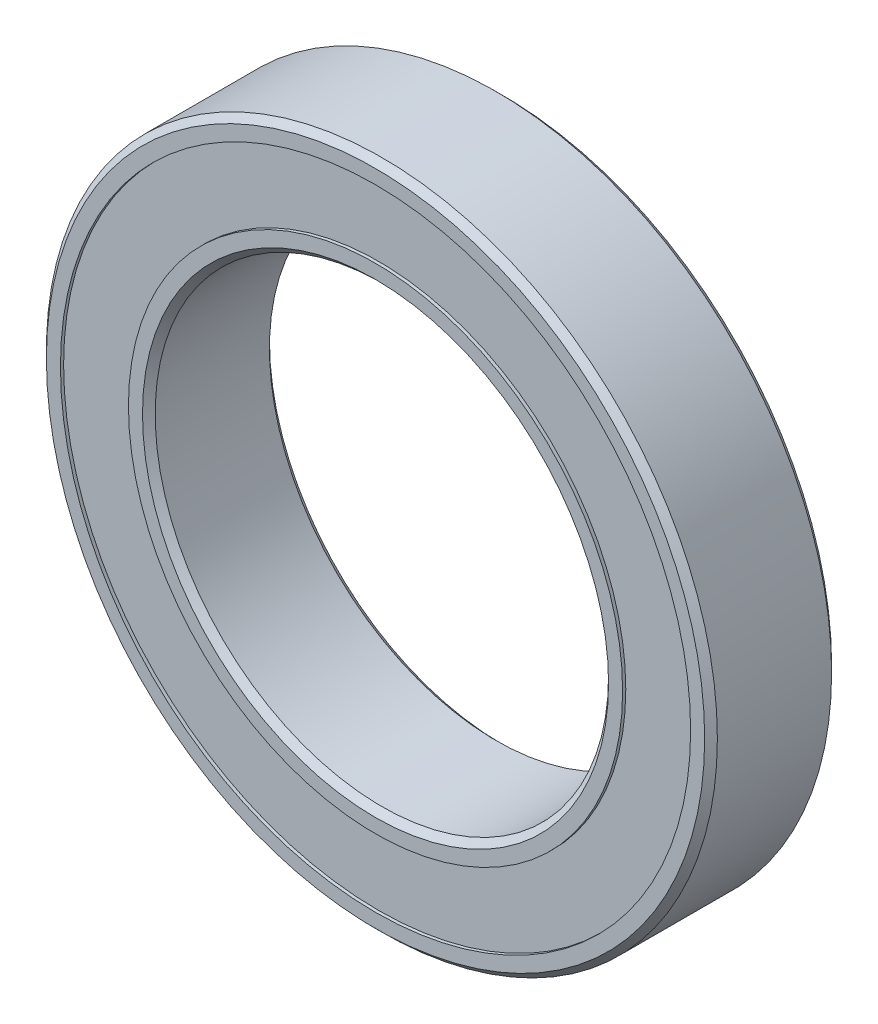
ISO-10303-21;
HEADER;
FILE_DESCRIPTION(('STEP AP214'),'2;1');
FILE_NAME('part.step','',(''),(''),'','','');
FILE_SCHEMA(('AUTOMOTIVE_DESIGN { 1 0 10303 214 1 1 1 1 }'));
ENDSEC;
DATA;
#1=APPLICATION_CONTEXT('core data for automotive mechanical design processes');
#2=APPLICATION_PROTOCOL_DEFINITION('international standard','automotive_design',2000,#1);
#3=PRODUCT_CONTEXT('',#1,'mechanical');
#4=PRODUCT('Part','Part','',(#3));
#5=PRODUCT_RELATED_PRODUCT_CATEGORY('part','',(#4));
#6=PRODUCT_DEFINITION_FORMATION('','',#4);
#7=PRODUCT_DEFINITION_CONTEXT('part definition',#1,'design');
#8=PRODUCT_DEFINITION('design','',#6,#7);
#9=PRODUCT_DEFINITION_SHAPE('','',#8);
#10=(LENGTH_UNIT() NAMED_UNIT(*) SI_UNIT(.MILLI.,.METRE.));
#11=(NAMED_UNIT(*) PLANE_ANGLE_UNIT() SI_UNIT($,.RADIAN.));
#12=(NAMED_UNIT(*) SI_UNIT($,.STERADIAN.) SOLID_ANGLE_UNIT());
#13=UNCERTAINTY_MEASURE_WITH_UNIT(LENGTH_MEASURE(1.E-05),#10,'distance_accuracy_value','');
#14=(GEOMETRIC_REPRESENTATION_CONTEXT(3) GLOBAL_UNCERTAINTY_ASSIGNED_CONTEXT((#13)) GLOBAL_UNIT_ASSIGNED_CONTEXT((#10,
#11,#12)) REPRESENTATION_CONTEXT('',''));
#15=CARTESIAN_POINT('',(0.,0.,0.));
#16=DIRECTION('',(0.,0.,1.));
#17=DIRECTION('',(1.,0.,0.));
#18=AXIS2_PLACEMENT_3D('',#15,#16,#17);
#19=CARTESIAN_POINT('',(0.,17.375,-3.325));
#20=DIRECTION('',(0.,0.,1.));
#21=DIRECTION('',(1.,0.,0.));
#22=AXIS2_PLACEMENT_3D('',#19,#20,#21);
#23=PLANE('',#22);
#24=CARTESIAN_POINT('',(0.,0.,-3.325));
#25=DIRECTION('',(0.,0.,1.));
#26=DIRECTION('',(1.,0.,0.));
#27=AXIS2_PLACEMENT_3D('',#24,#25,#26);
#28=CIRCLE('',#27,17.375);
#29=CARTESIAN_POINT('',(17.375,0.,-3.325));
#30=VERTEX_POINT('',#29);
#31=EDGE_CURVE('E69',#30,#30,#28,.T.);
#32=ORIENTED_EDGE('',*,*,#31,.F.);
#33=EDGE_LOOP('',(#32));
#34=FACE_BOUND('',#33,.T.);
#35=CARTESIAN_POINT('',(0.,0.,-3.325));
#36=DIRECTION('',(0.,0.,1.));
#37=DIRECTION('',(1.,0.,0.));
#38=AXIS2_PLACEMENT_3D('',#35,#36,#37);
#39=CIRCLE('',#38,13.625);
#40=CARTESIAN_POINT('',(13.625,0.,-3.325));
#41=VERTEX_POINT('',#40);
#42=EDGE_CURVE('E11',#41,#41,#39,.T.);
#43=ORIENTED_EDGE('',*,*,#42,.T.);
#44=EDGE_LOOP('',(#43));
#45=FACE_BOUND('',#44,.T.);
#46=ADVANCED_FACE('F55',(#34,#45),#23,.F.);
#47=CARTESIAN_POINT('',(0.,0.,3.5));
#48=DIRECTION('',(0.,0.,1.));
#49=DIRECTION('',(1.,0.,0.));
#50=AXIS2_PLACEMENT_3D('',#47,#48,#49);
#51=CYLINDRICAL_SURFACE('',#50,13.625);
#52=ORIENTED_EDGE('',*,*,#42,.F.);
#53=EDGE_LOOP('',(#52));
#54=FACE_BOUND('',#53,.T.);
#55=CARTESIAN_POINT('',(0.,0.,-2.4362631398147));
#56=DIRECTION('',(0.,0.,1.));
#57=DIRECTION('',(1.,0.,0.));
#58=AXIS2_PLACEMENT_3D('',#55,#56,#57);
#59=CIRCLE('',#58,13.625);
#60=CARTESIAN_POINT('',(13.625,0.,-2.4362631398147));
#61=VERTEX_POINT('',#60);
#62=EDGE_CURVE('E61',#61,#61,#59,.T.);
#63=ORIENTED_EDGE('',*,*,#62,.T.);
#64=EDGE_LOOP('',(#63));
#65=FACE_BOUND('',#64,.T.);
#66=ADVANCED_FACE('F78',(#54,#65),#51,.F.);
#67=CARTESIAN_POINT('',(0.,17.375,-2.4362631398147));
#68=DIRECTION('',(0.,0.,-1.));
#69=DIRECTION('',(-1.,0.,0.));
#70=AXIS2_PLACEMENT_3D('',#67,#68,#69);
#71=PLANE('',#70);
#72=ORIENTED_EDGE('',*,*,#62,.F.);
#73=EDGE_LOOP('',(#72));
#74=FACE_BOUND('',#73,.T.);
#75=CARTESIAN_POINT('',(0.,0.,-2.4362631398147));
#76=DIRECTION('',(0.,0.,1.));
#77=DIRECTION('',(1.,0.,0.));
#78=AXIS2_PLACEMENT_3D('',#75,#76,#77);
#79=CIRCLE('',#78,17.375);
#80=CARTESIAN_POINT('',(17.375,0.,-2.4362631398147));
#81=VERTEX_POINT('',#80);
#82=EDGE_CURVE('E65',#81,#81,#79,.T.);
#83=ORIENTED_EDGE('',*,*,#82,.T.);
#84=EDGE_LOOP('',(#83));
#85=FACE_BOUND('',#84,.T.);
#86=ADVANCED_FACE('F82',(#74,#85),#71,.F.);
#87=CARTESIAN_POINT('',(0.,0.,3.5));
#88=DIRECTION('',(0.,0.,1.));
#89=DIRECTION('',(1.,0.,0.));
#90=AXIS2_PLACEMENT_3D('',#87,#88,#89);
#91=CYLINDRICAL_SURFACE('',#90,17.375);
#92=ORIENTED_EDGE('',*,*,#82,.F.);
#93=EDGE_LOOP('',(#92));
#94=FACE_BOUND('',#93,.T.);
#95=ORIENTED_EDGE('',*,*,#31,.T.);
#96=EDGE_LOOP('',(#95));
#97=FACE_BOUND('',#96,.T.);
#98=ADVANCED_FACE('F75',(#94,#97),#91,.T.);
#99=CLOSED_SHELL('',(#46,#66,#86,#98));
#100=MANIFOLD_SOLID_BREP('B2',#99);
#101=CARTESIAN_POINT('',(0.,17.375,3.325));
#102=DIRECTION('',(0.,0.,-1.));
#103=DIRECTION('',(-1.,0.,0.));
#104=AXIS2_PLACEMENT_3D('',#101,#102,#103);
#105=PLANE('',#104);
#106=CARTESIAN_POINT('',(0.,0.,3.325));
#107=DIRECTION('',(0.,0.,1.));
#108=DIRECTION('',(1.,0.,0.));
#109=AXIS2_PLACEMENT_3D('',#106,#107,#108);
#110=CIRCLE('',#109,13.625);
#111=CARTESIAN_POINT('',(13.625,0.,3.325));
#112=VERTEX_POINT('',#111);
#113=EDGE_CURVE('E54',#112,#112,#110,.T.);
#114=ORIENTED_EDGE('',*,*,#113,.F.);
#115=EDGE_LOOP('',(#114));
#116=FACE_BOUND('',#115,.T.);
#117=CARTESIAN_POINT('',(0.,0.,3.325));
#118=DIRECTION('',(0.,0.,1.));
#119=DIRECTION('',(1.,0.,0.));
#120=AXIS2_PLACEMENT_3D('',#117,#118,#119);
#121=CIRCLE('',#120,17.375);
#122=CARTESIAN_POINT('',(17.375,0.,3.325));
#123=VERTEX_POINT('',#122);
#124=EDGE_CURVE('E142',#123,#123,#121,.T.);
#125=ORIENTED_EDGE('',*,*,#124,.T.);
#126=EDGE_LOOP('',(#125));
#127=FACE_BOUND('',#126,.T.);
#128=ADVANCED_FACE('F128',(#116,#127),#105,.F.);
#129=CARTESIAN_POINT('',(0.,0.,3.5));
#130=DIRECTION('',(0.,0.,1.));
#131=DIRECTION('',(1.,0.,0.));
#132=AXIS2_PLACEMENT_3D('',#129,#130,#131);
#133=CYLINDRICAL_SURFACE('',#132,13.625);
#134=CARTESIAN_POINT('',(0.,0.,2.4362631398147));
#135=DIRECTION('',(0.,0.,1.));
#136=DIRECTION('',(1.,0.,0.));
#137=AXIS2_PLACEMENT_3D('',#134,#135,#136);
#138=CIRCLE('',#137,13.625);
#139=CARTESIAN_POINT('',(13.625,0.,2.4362631398147));
#140=VERTEX_POINT('',#139);
#141=EDGE_CURVE('E134',#140,#140,#138,.T.);
#142=ORIENTED_EDGE('',*,*,#141,.F.);
#143=EDGE_LOOP('',(#142));
#144=FACE_BOUND('',#143,.T.);
#145=ORIENTED_EDGE('',*,*,#113,.T.);
#146=EDGE_LOOP('',(#145));
#147=FACE_BOUND('',#146,.T.);
#148=ADVANCED_FACE('F157',(#144,#147),#133,.F.);
#149=CARTESIAN_POINT('',(0.,17.375,2.4362631398147));
#150=DIRECTION('',(0.,0.,1.));
#151=DIRECTION('',(1.,0.,0.));
#152=AXIS2_PLACEMENT_3D('',#149,#150,#151);
#153=PLANE('',#152);
#154=CARTESIAN_POINT('',(0.,0.,2.4362631398147));
#155=DIRECTION('',(0.,0.,1.));
#156=DIRECTION('',(1.,0.,0.));
#157=AXIS2_PLACEMENT_3D('',#154,#155,#156);
#158=CIRCLE('',#157,17.375);
#159=CARTESIAN_POINT('',(17.375,0.,2.4362631398147));
#160=VERTEX_POINT('',#159);
#161=EDGE_CURVE('E138',#160,#160,#158,.T.);
#162=ORIENTED_EDGE('',*,*,#161,.F.);
#163=EDGE_LOOP('',(#162));
#164=FACE_BOUND('',#163,.T.);
#165=ORIENTED_EDGE('',*,*,#141,.T.);
#166=EDGE_LOOP('',(#165));
#167=FACE_BOUND('',#166,.T.);
#168=ADVANCED_FACE('F152',(#164,#167),#153,.F.);
#169=CARTESIAN_POINT('',(0.,0.,3.5));
#170=DIRECTION('',(0.,0.,1.));
#171=DIRECTION('',(1.,0.,0.));
#172=AXIS2_PLACEMENT_3D('',#169,#170,#171);
#173=CYLINDRICAL_SURFACE('',#172,17.375);
#174=ORIENTED_EDGE('',*,*,#124,.F.);
#175=EDGE_LOOP('',(#174));
#176=FACE_BOUND('',#175,.T.);
#177=ORIENTED_EDGE('',*,*,#161,.T.);
#178=EDGE_LOOP('',(#177));
#179=FACE_BOUND('',#178,.T.);
#180=ADVANCED_FACE('F149',(#176,#179),#173,.T.);
#181=CLOSED_SHELL('',(#128,#148,#168,#180));
#182=MANIFOLD_SOLID_BREP('B6',#181);
#183=CARTESIAN_POINT('',(-7.74999999999983,13.4233937586589,0.));
#184=DIRECTION('',(0.,0.,1.));
#185=DIRECTION('',(-0.499999999999989,0.866025403784445,0.));
#186=AXIS2_PLACEMENT_3D('',#183,#184,#185);
#187=SPHERICAL_SURFACE('',#186,2.4362631398147);
#188=CARTESIAN_POINT('',(-7.74999999999983,13.4233937586589,2.4362631398147));
#189=VERTEX_POINT('',#188);
#190=VERTEX_LOOP('',#189);
#191=FACE_BOUND('',#190,.T.);
#192=ADVANCED_FACE('F195',(#191),#187,.T.);
#193=CLOSED_SHELL('',(#192));
#194=MANIFOLD_SOLID_BREP('B49',#193);
#195=CARTESIAN_POINT('',(-13.4233937586587,7.75000000000016,0.));
#196=DIRECTION('',(0.,0.,1.));
#197=DIRECTION('',(-0.866025403784433,0.50000000000001,0.));
#198=AXIS2_PLACEMENT_3D('',#195,#196,#197);
#199=SPHERICAL_SURFACE('',#198,2.4362631398147);
#200=CARTESIAN_POINT('',(-13.4233937586587,7.75000000000016,2.4362631398147));
#201=VERTEX_POINT('',#200);
#202=VERTEX_LOOP('',#201);
#203=FACE_BOUND('',#202,.T.);
#204=ADVANCED_FACE('F215',(#203),#199,.T.);
#205=CLOSED_SHELL('',(#204));
#206=MANIFOLD_SOLID_BREP('B124',#205);
#207=CARTESIAN_POINT('',(-15.5,1.62353882256206E-13,0.));
#208=DIRECTION('',(0.,0.,1.));
#209=DIRECTION('',(-1.,0.,0.));
#210=AXIS2_PLACEMENT_3D('',#207,#208,#209);
#211=SPHERICAL_SURFACE('',#210,2.4362631398147);
#212=CARTESIAN_POINT('',(-15.5,1.62353882256206E-13,2.4362631398147));
#213=VERTEX_POINT('',#212);
#214=VERTEX_LOOP('',#213);
#215=FACE_BOUND('',#214,.T.);
#216=ADVANCED_FACE('F235',(#215),#211,.T.);
#217=CLOSED_SHELL('',(#216));
#218=MANIFOLD_SOLID_BREP('B191',#217);
#219=CARTESIAN_POINT('',(-13.4233937586589,-7.74999999999987,0.));
#220=DIRECTION('',(0.,0.,1.));
#221=DIRECTION('',(-0.866025403784443,-0.499999999999992,0.));
#222=AXIS2_PLACEMENT_3D('',#219,#220,#221);
#223=SPHERICAL_SURFACE('',#222,2.4362631398147);
#224=CARTESIAN_POINT('',(-13.4233937586589,-7.74999999999987,2.4362631398147));
#225=VERTEX_POINT('',#224);
#226=VERTEX_LOOP('',#225);
#227=FACE_BOUND('',#226,.T.);
#228=ADVANCED_FACE('F255',(#227),#223,.T.);
#229=CLOSED_SHELL('',(#228));
#230=MANIFOLD_SOLID_BREP('B211',#229);
#231=CARTESIAN_POINT('',(-7.75000000000011,-13.4233937586587,0.));
#232=DIRECTION('',(0.,0.,1.));
#233=DIRECTION('',(-0.500000000000007,-0.866025403784435,0.));
#234=AXIS2_PLACEMENT_3D('',#231,#232,#233);
#235=SPHERICAL_SURFACE('',#234,2.4362631398147);
#236=CARTESIAN_POINT('',(-7.75000000000011,-13.4233937586587,2.4362631398147));
#237=VERTEX_POINT('',#236);
#238=VERTEX_LOOP('',#237);
#239=FACE_BOUND('',#238,.T.);
#240=ADVANCED_FACE('F275',(#239),#235,.T.);
#241=CLOSED_SHELL('',(#240));
#242=MANIFOLD_SOLID_BREP('B231',#241);
#243=CARTESIAN_POINT('',(-1.08235921504137E-13,-15.5,0.));
#244=DIRECTION('',(0.,0.,1.));
#245=DIRECTION('',(0.,-1.,0.));
#246=AXIS2_PLACEMENT_3D('',#243,#244,#245);
#247=SPHERICAL_SURFACE('',#246,2.4362631398147);
#248=CARTESIAN_POINT('',(-1.08235921504137E-13,-15.5,2.4362631398147));
#249=VERTEX_POINT('',#248);
#250=VERTEX_LOOP('',#249);
#251=FACE_BOUND('',#250,.T.);
#252=ADVANCED_FACE('F295',(#251),#247,.T.);
#253=CLOSED_SHELL('',(#252));
#254=MANIFOLD_SOLID_BREP('B251',#253);
#255=CARTESIAN_POINT('',(7.74999999999992,-13.4233937586588,0.));
#256=DIRECTION('',(0.,0.,1.));
#257=DIRECTION('',(0.499999999999995,-0.866025403784442,0.));
#258=AXIS2_PLACEMENT_3D('',#255,#256,#257);
#259=SPHERICAL_SURFACE('',#258,2.4362631398147);
#260=CARTESIAN_POINT('',(7.74999999999992,-13.4233937586588,2.4362631398147));
#261=VERTEX_POINT('',#260);
#262=VERTEX_LOOP('',#261);
#263=FACE_BOUND('',#262,.T.);
#264=ADVANCED_FACE('F315',(#263),#259,.T.);
#265=CLOSED_SHELL('',(#264));
#266=MANIFOLD_SOLID_BREP('B271',#265);
#267=CARTESIAN_POINT('',(13.4233937586588,-7.75000000000006,0.));
#268=DIRECTION('',(0.,0.,1.));
#269=DIRECTION('',(0.866025403784436,-0.500000000000004,0.));
#270=AXIS2_PLACEMENT_3D('',#267,#268,#269);
#271=SPHERICAL_SURFACE('',#270,2.4362631398147);
#272=CARTESIAN_POINT('',(13.4233937586588,-7.75000000000006,2.4362631398147));
#273=VERTEX_POINT('',#272);
#274=VERTEX_LOOP('',#273);
#275=FACE_BOUND('',#274,.T.);
#276=ADVANCED_FACE('F335',(#275),#271,.T.);
#277=CLOSED_SHELL('',(#276));
#278=MANIFOLD_SOLID_BREP('B291',#277);
#279=CARTESIAN_POINT('',(15.5,0.,0.));
#280=DIRECTION('',(0.,0.,1.));
#281=DIRECTION('',(1.,0.,0.));
#282=AXIS2_PLACEMENT_3D('',#279,#280,#281);
#283=SPHERICAL_SURFACE('',#282,2.4362631398147);
#284=CARTESIAN_POINT('',(15.5,0.,2.4362631398147));
#285=VERTEX_POINT('',#284);
#286=VERTEX_LOOP('',#285);
#287=FACE_BOUND('',#286,.T.);
#288=ADVANCED_FACE('F355',(#287),#283,.T.);
#289=CLOSED_SHELL('',(#288));
#290=MANIFOLD_SOLID_BREP('B311',#289);
#291=CARTESIAN_POINT('',(13.4233937586588,7.74999999999997,0.));
#292=DIRECTION('',(0.,0.,1.));
#293=DIRECTION('',(0.86602540378444,0.499999999999998,0.));
#294=AXIS2_PLACEMENT_3D('',#291,#292,#293);
#295=SPHERICAL_SURFACE('',#294,2.4362631398147);
#296=CARTESIAN_POINT('',(13.4233937586588,7.74999999999997,2.4362631398147));
#297=VERTEX_POINT('',#296);
#298=VERTEX_LOOP('',#297);
#299=FACE_BOUND('',#298,.T.);
#300=ADVANCED_FACE('F375',(#299),#295,.T.);
#301=CLOSED_SHELL('',(#300));
#302=MANIFOLD_SOLID_BREP('B331',#301);
#303=CARTESIAN_POINT('',(7.75000000000002,13.4233937586588,0.));
#304=DIRECTION('',(0.,0.,1.));
#305=DIRECTION('',(0.500000000000001,0.866025403784438,0.));
#306=AXIS2_PLACEMENT_3D('',#303,#304,#305);
#307=SPHERICAL_SURFACE('',#306,2.4362631398147);
#308=CARTESIAN_POINT('',(7.75000000000002,13.4233937586588,2.4362631398147));
#309=VERTEX_POINT('',#308);
#310=VERTEX_LOOP('',#309);
#311=FACE_BOUND('',#310,.T.);
#312=ADVANCED_FACE('F395',(#311),#307,.T.);
#313=CLOSED_SHELL('',(#312));
#314=MANIFOLD_SOLID_BREP('B351',#313);
#315=CARTESIAN_POINT('',(0.,15.5,0.));
#316=DIRECTION('',(0.,0.,1.));
#317=DIRECTION('',(0.,1.,0.));
#318=AXIS2_PLACEMENT_3D('',#315,#316,#317);
#319=SPHERICAL_SURFACE('',#318,2.4362631398147);
#320=CARTESIAN_POINT('',(0.,15.5,2.4362631398147));
#321=VERTEX_POINT('',#320);
#322=VERTEX_LOOP('',#321);
#323=FACE_BOUND('',#322,.T.);
#324=ADVANCED_FACE('F419',(#323),#319,.T.);
#325=CLOSED_SHELL('',(#324));
#326=MANIFOLD_SOLID_BREP('B371',#325);
#327=CARTESIAN_POINT('',(0.,0.,3.5));
#328=DIRECTION('',(0.,0.,1.));
#329=DIRECTION('',(1.,0.,0.));
#330=AXIS2_PLACEMENT_3D('',#327,#328,#329);
#331=CONICAL_SURFACE('',#330,12.85,0.78539816339745);
#332=CARTESIAN_POINT('',(0.,0.,3.15));
#333=DIRECTION('',(0.,0.,1.));
#334=DIRECTION('',(1.,0.,0.));
#335=AXIS2_PLACEMENT_3D('',#332,#333,#334);
#336=CIRCLE('',#335,12.5);
#337=CARTESIAN_POINT('',(12.5,0.,3.15));
#338=VERTEX_POINT('',#337);
#339=EDGE_CURVE('E418',#338,#338,#336,.T.);
#340=ORIENTED_EDGE('',*,*,#339,.F.);
#341=EDGE_LOOP('',(#340));
#342=FACE_BOUND('',#341,.T.);
#343=CARTESIAN_POINT('',(0.,0.,3.5));
#344=DIRECTION('',(0.,0.,1.));
#345=DIRECTION('',(1.,0.,0.));
#346=AXIS2_PLACEMENT_3D('',#343,#344,#345);
#347=CIRCLE('',#346,12.85);
#348=CARTESIAN_POINT('',(12.85,0.,3.5));
#349=VERTEX_POINT('',#348);
#350=EDGE_CURVE('E472',#349,#349,#347,.T.);
#351=ORIENTED_EDGE('',*,*,#350,.T.);
#352=EDGE_LOOP('',(#351));
#353=FACE_BOUND('',#352,.T.);
#354=ADVANCED_FACE('F444',(#342,#353),#331,.F.);
#355=CARTESIAN_POINT('',(0.,0.,3.5));
#356=DIRECTION('',(0.,0.,1.));
#357=DIRECTION('',(1.,0.,0.));
#358=AXIS2_PLACEMENT_3D('',#355,#356,#357);
#359=CYLINDRICAL_SURFACE('',#358,12.5);
#360=CARTESIAN_POINT('',(0.,0.,-3.15));
#361=DIRECTION('',(0.,0.,1.));
#362=DIRECTION('',(1.,0.,0.));
#363=AXIS2_PLACEMENT_3D('',#360,#361,#362);
#364=CIRCLE('',#363,12.5);
#365=CARTESIAN_POINT('',(12.5,0.,-3.15));
#366=VERTEX_POINT('',#365);
#367=EDGE_CURVE('E450',#366,#366,#364,.T.);
#368=ORIENTED_EDGE('',*,*,#367,.F.);
#369=EDGE_LOOP('',(#368));
#370=FACE_BOUND('',#369,.T.);
#371=ORIENTED_EDGE('',*,*,#339,.T.);
#372=EDGE_LOOP('',(#371));
#373=FACE_BOUND('',#372,.T.);
#374=ADVANCED_FACE('F509',(#370,#373),#359,.F.);
#375=CARTESIAN_POINT('',(0.,0.,-3.15));
#376=DIRECTION('',(0.,0.,-1.));
#377=DIRECTION('',(-1.,0.,0.));
#378=AXIS2_PLACEMENT_3D('',#375,#376,#377);
#379=CONICAL_SURFACE('',#378,12.5,0.785398163397451);
#380=CARTESIAN_POINT('',(0.,0.,-3.5));
#381=DIRECTION('',(0.,0.,1.));
#382=DIRECTION('',(1.,0.,0.));
#383=AXIS2_PLACEMENT_3D('',#380,#381,#382);
#384=CIRCLE('',#383,12.85);
#385=CARTESIAN_POINT('',(12.85,0.,-3.5));
#386=VERTEX_POINT('',#385);
#387=EDGE_CURVE('E454',#386,#386,#384,.T.);
#388=ORIENTED_EDGE('',*,*,#387,.F.);
#389=EDGE_LOOP('',(#388));
#390=FACE_BOUND('',#389,.T.);
#391=ORIENTED_EDGE('',*,*,#367,.T.);
#392=EDGE_LOOP('',(#391));
#393=FACE_BOUND('',#392,.T.);
#394=ADVANCED_FACE('F504',(#390,#393),#379,.F.);
#395=CARTESIAN_POINT('',(0.,12.85,-3.5));
#396=DIRECTION('',(0.,0.,1.));
#397=DIRECTION('',(1.,0.,0.));
#398=AXIS2_PLACEMENT_3D('',#395,#396,#397);
#399=PLANE('',#398);
#400=CARTESIAN_POINT('',(0.,0.,-3.5));
#401=DIRECTION('',(0.,0.,1.));
#402=DIRECTION('',(1.,0.,0.));
#403=AXIS2_PLACEMENT_3D('',#400,#401,#402);
#404=CIRCLE('',#403,13.625);
#405=CARTESIAN_POINT('',(13.625,0.,-3.5));
#406=VERTEX_POINT('',#405);
#407=EDGE_CURVE('E458',#406,#406,#404,.T.);
#408=ORIENTED_EDGE('',*,*,#407,.F.);
#409=EDGE_LOOP('',(#408));
#410=FACE_BOUND('',#409,.T.);
#411=ORIENTED_EDGE('',*,*,#387,.T.);
#412=EDGE_LOOP('',(#411));
#413=FACE_BOUND('',#412,.T.);
#414=ADVANCED_FACE('F498',(#410,#413),#399,.F.);
#415=CARTESIAN_POINT('',(0.,0.,3.5));
#416=DIRECTION('',(0.,0.,1.));
#417=DIRECTION('',(1.,0.,0.));
#418=AXIS2_PLACEMENT_3D('',#415,#416,#417);
#419=CYLINDRICAL_SURFACE('',#418,13.625);
#420=CARTESIAN_POINT('',(0.,0.,-1.55555555555555));
#421=DIRECTION('',(0.,0.,1.));
#422=DIRECTION('',(1.,0.,0.));
#423=AXIS2_PLACEMENT_3D('',#420,#421,#422);
#424=CIRCLE('',#423,13.625);
#425=CARTESIAN_POINT('',(13.625,0.,-1.55555555555555));
#426=VERTEX_POINT('',#425);
#427=EDGE_CURVE('E463',#426,#426,#424,.T.);
#428=ORIENTED_EDGE('',*,*,#427,.F.);
#429=EDGE_LOOP('',(#428));
#430=FACE_BOUND('',#429,.T.);
#431=ORIENTED_EDGE('',*,*,#407,.T.);
#432=EDGE_LOOP('',(#431));
#433=FACE_BOUND('',#432,.T.);
#434=ADVANCED_FACE('F492',(#430,#433),#419,.T.);
#435=CARTESIAN_POINT('',(0.,0.,0.));
#436=DIRECTION('',(0.,0.,1.));
#437=DIRECTION('',(1.,0.,0.));
#438=AXIS2_PLACEMENT_3D('',#435,#436,#437);
#439=TOROIDAL_SURFACE('',#438,15.5,2.4362631398147);
#440=CARTESIAN_POINT('',(0.,0.,1.55555555555556));
#441=DIRECTION('',(0.,0.,1.));
#442=DIRECTION('',(1.,0.,0.));
#443=AXIS2_PLACEMENT_3D('',#440,#441,#442);
#444=CIRCLE('',#443,13.625);
#445=CARTESIAN_POINT('',(13.625,0.,1.55555555555556));
#446=VERTEX_POINT('',#445);
#447=EDGE_CURVE('E466',#446,#446,#444,.T.);
#448=ORIENTED_EDGE('',*,*,#447,.F.);
#449=EDGE_LOOP('',(#448));
#450=FACE_BOUND('',#449,.T.);
#451=ORIENTED_EDGE('',*,*,#427,.T.);
#452=EDGE_LOOP('',(#451));
#453=FACE_BOUND('',#452,.T.);
#454=ADVANCED_FACE('F486',(#450,#453),#439,.F.);
#455=CARTESIAN_POINT('',(0.,0.,3.5));
#456=DIRECTION('',(0.,0.,1.));
#457=DIRECTION('',(1.,0.,0.));
#458=AXIS2_PLACEMENT_3D('',#455,#456,#457);
#459=CYLINDRICAL_SURFACE('',#458,13.625);
#460=CARTESIAN_POINT('',(0.,0.,3.5));
#461=DIRECTION('',(0.,0.,1.));
#462=DIRECTION('',(1.,0.,0.));
#463=AXIS2_PLACEMENT_3D('',#460,#461,#462);
#464=CIRCLE('',#463,13.625);
#465=CARTESIAN_POINT('',(13.625,0.,3.5));
#466=VERTEX_POINT('',#465);
#467=EDGE_CURVE('E469',#466,#466,#464,.T.);
#468=ORIENTED_EDGE('',*,*,#467,.F.);
#469=EDGE_LOOP('',(#468));
#470=FACE_BOUND('',#469,.T.);
#471=ORIENTED_EDGE('',*,*,#447,.T.);
#472=EDGE_LOOP('',(#471));
#473=FACE_BOUND('',#472,.T.);
#474=ADVANCED_FACE('F480',(#470,#473),#459,.T.);
#475=CARTESIAN_POINT('',(0.,12.85,3.5));
#476=DIRECTION('',(0.,0.,-1.));
#477=DIRECTION('',(-1.,0.,0.));
#478=AXIS2_PLACEMENT_3D('',#475,#476,#477);
#479=PLANE('',#478);
#480=ORIENTED_EDGE('',*,*,#350,.F.);
#481=EDGE_LOOP('',(#480));
#482=FACE_BOUND('',#481,.T.);
#483=ORIENTED_EDGE('',*,*,#467,.T.);
#484=EDGE_LOOP('',(#483));
#485=FACE_BOUND('',#484,.T.);
#486=ADVANCED_FACE('F477',(#482,#485),#479,.F.);
#487=CLOSED_SHELL('',(#354,#374,#394,#414,#434,#454,#474,#486));
#488=MANIFOLD_SOLID_BREP('B391',#487);
#489=CARTESIAN_POINT('',(0.,0.,3.15));
#490=DIRECTION('',(0.,0.,-1.));
#491=DIRECTION('',(-1.,0.,0.));
#492=AXIS2_PLACEMENT_3D('',#489,#490,#491);
#493=CONICAL_SURFACE('',#492,18.5,0.785398163397449);
#494=CARTESIAN_POINT('',(0.,0.,3.5));
#495=DIRECTION('',(0.,0.,1.));
#496=DIRECTION('',(1.,0.,0.));
#497=AXIS2_PLACEMENT_3D('',#494,#495,#496);
#498=CIRCLE('',#497,18.15);
#499=CARTESIAN_POINT('',(18.15,0.,3.5));
#500=VERTEX_POINT('',#499);
#501=EDGE_CURVE('E443',#500,#500,#498,.T.);
#502=ORIENTED_EDGE('',*,*,#501,.F.);
#503=EDGE_LOOP('',(#502));
#504=FACE_BOUND('',#503,.T.);
#505=CARTESIAN_POINT('',(0.,0.,3.15));
#506=DIRECTION('',(0.,0.,1.));
#507=DIRECTION('',(1.,0.,0.));
#508=AXIS2_PLACEMENT_3D('',#505,#506,#507);
#509=CIRCLE('',#508,18.5);
#510=CARTESIAN_POINT('',(18.5,0.,3.15));
#511=VERTEX_POINT('',#510);
#512=EDGE_CURVE('E601',#511,#511,#509,.T.);
#513=ORIENTED_EDGE('',*,*,#512,.T.);
#514=EDGE_LOOP('',(#513));
#515=FACE_BOUND('',#514,.T.);
#516=ADVANCED_FACE('F566',(#504,#515),#493,.T.);
#517=CARTESIAN_POINT('',(0.,18.15,3.5));
#518=DIRECTION('',(0.,0.,-1.));
#519=DIRECTION('',(-1.,0.,0.));
#520=AXIS2_PLACEMENT_3D('',#517,#518,#519);
#521=PLANE('',#520);
#522=CARTESIAN_POINT('',(0.,0.,3.5));
#523=DIRECTION('',(0.,0.,1.));
#524=DIRECTION('',(1.,0.,0.));
#525=AXIS2_PLACEMENT_3D('',#522,#523,#524);
#526=CIRCLE('',#525,17.375);
#527=CARTESIAN_POINT('',(17.375,0.,3.5));
#528=VERTEX_POINT('',#527);
#529=EDGE_CURVE('E573',#528,#528,#526,.T.);
#530=ORIENTED_EDGE('',*,*,#529,.F.);
#531=EDGE_LOOP('',(#530));
#532=FACE_BOUND('',#531,.T.);
#533=ORIENTED_EDGE('',*,*,#501,.T.);
#534=EDGE_LOOP('',(#533));
#535=FACE_BOUND('',#534,.T.);
#536=ADVANCED_FACE('F639',(#532,#535),#521,.F.);
#537=CARTESIAN_POINT('',(0.,0.,3.5));
#538=DIRECTION('',(0.,0.,1.));
#539=DIRECTION('',(1.,0.,0.));
#540=AXIS2_PLACEMENT_3D('',#537,#538,#539);
#541=CYLINDRICAL_SURFACE('',#540,17.375);
#542=CARTESIAN_POINT('',(0.,0.,1.55555555555556));
#543=DIRECTION('',(0.,0.,1.));
#544=DIRECTION('',(1.,0.,0.));
#545=AXIS2_PLACEMENT_3D('',#542,#543,#544);
#546=CIRCLE('',#545,17.375);
#547=CARTESIAN_POINT('',(17.375,0.,1.55555555555556));
#548=VERTEX_POINT('',#547);
#549=EDGE_CURVE('E578',#548,#548,#546,.T.);
#550=ORIENTED_EDGE('',*,*,#549,.F.);
#551=EDGE_LOOP('',(#550));
#552=FACE_BOUND('',#551,.T.);
#553=ORIENTED_EDGE('',*,*,#529,.T.);
#554=EDGE_LOOP('',(#553));
#555=FACE_BOUND('',#554,.T.);
#556=ADVANCED_FACE('F634',(#552,#555),#541,.F.);
#557=CARTESIAN_POINT('',(0.,0.,0.));
#558=DIRECTION('',(0.,0.,1.));
#559=DIRECTION('',(1.,0.,0.));
#560=AXIS2_PLACEMENT_3D('',#557,#558,#559);
#561=TOROIDAL_SURFACE('',#560,15.5,2.4362631398147);
#562=CARTESIAN_POINT('',(0.,0.,-1.55555555555556));
#563=DIRECTION('',(0.,0.,1.));
#564=DIRECTION('',(1.,0.,0.));
#565=AXIS2_PLACEMENT_3D('',#562,#563,#564);
#566=CIRCLE('',#565,17.375);
#567=CARTESIAN_POINT('',(17.375,0.,-1.55555555555556));
#568=VERTEX_POINT('',#567);
#569=EDGE_CURVE('E583',#568,#568,#566,.T.);
#570=ORIENTED_EDGE('',*,*,#569,.F.);
#571=EDGE_LOOP('',(#570));
#572=FACE_BOUND('',#571,.T.);
#573=ORIENTED_EDGE('',*,*,#549,.T.);
#574=EDGE_LOOP('',(#573));
#575=FACE_BOUND('',#574,.T.);
#576=ADVANCED_FACE('F628',(#572,#575),#561,.F.);
#577=CARTESIAN_POINT('',(0.,0.,3.5));
#578=DIRECTION('',(0.,0.,1.));
#579=DIRECTION('',(1.,0.,0.));
#580=AXIS2_PLACEMENT_3D('',#577,#578,#579);
#581=CYLINDRICAL_SURFACE('',#580,17.375);
#582=CARTESIAN_POINT('',(0.,0.,-3.5));
#583=DIRECTION('',(0.,0.,1.));
#584=DIRECTION('',(1.,0.,0.));
#585=AXIS2_PLACEMENT_3D('',#582,#583,#584);
#586=CIRCLE('',#585,17.375);
#587=CARTESIAN_POINT('',(17.375,0.,-3.5));
#588=VERTEX_POINT('',#587);
#589=EDGE_CURVE('E589',#588,#588,#586,.T.);
#590=ORIENTED_EDGE('',*,*,#589,.F.);
#591=EDGE_LOOP('',(#590));
#592=FACE_BOUND('',#591,.T.);
#593=ORIENTED_EDGE('',*,*,#569,.T.);
#594=EDGE_LOOP('',(#593));
#595=FACE_BOUND('',#594,.T.);
#596=ADVANCED_FACE('F622',(#592,#595),#581,.F.);
#597=CARTESIAN_POINT('',(0.,18.15,-3.5));
#598=DIRECTION('',(0.,0.,1.));
#599=DIRECTION('',(1.,0.,0.));
#600=AXIS2_PLACEMENT_3D('',#597,#598,#599);
#601=PLANE('',#600);
#602=CARTESIAN_POINT('',(0.,0.,-3.5));
#603=DIRECTION('',(0.,0.,1.));
#604=DIRECTION('',(1.,0.,0.));
#605=AXIS2_PLACEMENT_3D('',#602,#603,#604);
#606=CIRCLE('',#605,18.15);
#607=CARTESIAN_POINT('',(18.15,0.,-3.5));
#608=VERTEX_POINT('',#607);
#609=EDGE_CURVE('E593',#608,#608,#606,.T.);
#610=ORIENTED_EDGE('',*,*,#609,.F.);
#611=EDGE_LOOP('',(#610));
#612=FACE_BOUND('',#611,.T.);
#613=ORIENTED_EDGE('',*,*,#589,.T.);
#614=EDGE_LOOP('',(#613));
#615=FACE_BOUND('',#614,.T.);
#616=ADVANCED_FACE('F616',(#612,#615),#601,.F.);
#617=CARTESIAN_POINT('',(0.,0.,-3.5));
#618=DIRECTION('',(0.,0.,1.));
#619=DIRECTION('',(1.,0.,0.));
#620=AXIS2_PLACEMENT_3D('',#617,#618,#619);
#621=CONICAL_SURFACE('',#620,18.15,0.78539816339745);
#622=CARTESIAN_POINT('',(0.,0.,-3.15));
#623=DIRECTION('',(0.,0.,1.));
#624=DIRECTION('',(1.,0.,0.));
#625=AXIS2_PLACEMENT_3D('',#622,#623,#624);
#626=CIRCLE('',#625,18.5);
#627=CARTESIAN_POINT('',(18.5,0.,-3.15));
#628=VERTEX_POINT('',#627);
#629=EDGE_CURVE('E597',#628,#628,#626,.T.);
#630=ORIENTED_EDGE('',*,*,#629,.F.);
#631=EDGE_LOOP('',(#630));
#632=FACE_BOUND('',#631,.T.);
#633=ORIENTED_EDGE('',*,*,#609,.T.);
#634=EDGE_LOOP('',(#633));
#635=FACE_BOUND('',#634,.T.);
#636=ADVANCED_FACE('F610',(#632,#635),#621,.T.);
#637=CARTESIAN_POINT('',(0.,0.,3.5));
#638=DIRECTION('',(0.,0.,1.));
#639=DIRECTION('',(1.,0.,0.));
#640=AXIS2_PLACEMENT_3D('',#637,#638,#639);
#641=CYLINDRICAL_SURFACE('',#640,18.5);
#642=ORIENTED_EDGE('',*,*,#512,.F.);
#643=EDGE_LOOP('',(#642));
#644=FACE_BOUND('',#643,.T.);
#645=ORIENTED_EDGE('',*,*,#629,.T.);
#646=EDGE_LOOP('',(#645));
#647=FACE_BOUND('',#646,.T.);
#648=ADVANCED_FACE('F607',(#644,#647),#641,.T.);
#649=CLOSED_SHELL('',(#516,#536,#556,#576,#596,#616,#636,#648));
#650=MANIFOLD_SOLID_BREP('B413',#649);
#651=ADVANCED_BREP_SHAPE_REPRESENTATION('',(#18,#100,#182,#194,#206,#218,#230,#242,#254,#266,
#278,#290,#302,#314,#326,#488,#650),#14);
#652=SHAPE_DEFINITION_REPRESENTATION(#9,#651);
ENDSEC;
END-ISO-10303-21;
